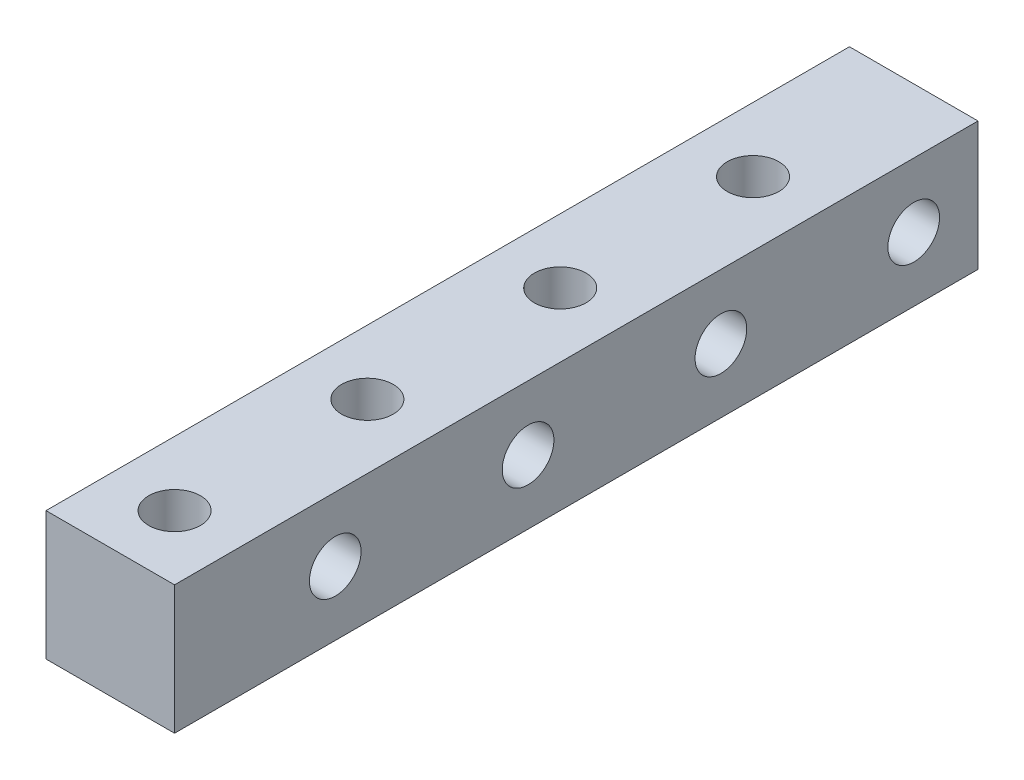
ISO-10303-21;
HEADER;
FILE_DESCRIPTION(('STEP AP214'),'2;1');
FILE_NAME('part.step','',(''),(''),'','','');
FILE_SCHEMA(('AUTOMOTIVE_DESIGN { 1 0 10303 214 1 1 1 1 }'));
ENDSEC;
DATA;
#1=APPLICATION_CONTEXT('core data for automotive mechanical design processes');
#2=APPLICATION_PROTOCOL_DEFINITION('international standard','automotive_design',2000,#1);
#3=PRODUCT_CONTEXT('',#1,'mechanical');
#4=PRODUCT('Part','Part','',(#3));
#5=PRODUCT_RELATED_PRODUCT_CATEGORY('part','',(#4));
#6=PRODUCT_DEFINITION_FORMATION('','',#4);
#7=PRODUCT_DEFINITION_CONTEXT('part definition',#1,'design');
#8=PRODUCT_DEFINITION('design','',#6,#7);
#9=PRODUCT_DEFINITION_SHAPE('','',#8);
#10=(LENGTH_UNIT() NAMED_UNIT(*) SI_UNIT(.MILLI.,.METRE.));
#11=(NAMED_UNIT(*) PLANE_ANGLE_UNIT() SI_UNIT($,.RADIAN.));
#12=(NAMED_UNIT(*) SI_UNIT($,.STERADIAN.) SOLID_ANGLE_UNIT());
#13=UNCERTAINTY_MEASURE_WITH_UNIT(LENGTH_MEASURE(1.E-05),#10,'distance_accuracy_value','');
#14=(GEOMETRIC_REPRESENTATION_CONTEXT(3) GLOBAL_UNCERTAINTY_ASSIGNED_CONTEXT((#13)) GLOBAL_UNIT_ASSIGNED_CONTEXT((#10,
#11,#12)) REPRESENTATION_CONTEXT('',''));
#15=CARTESIAN_POINT('',(0.,0.,0.));
#16=DIRECTION('',(0.,0.,1.));
#17=DIRECTION('',(1.,0.,0.));
#18=AXIS2_PLACEMENT_3D('',#15,#16,#17);
#19=CARTESIAN_POINT('',(6.35,0.,-73.025));
#20=DIRECTION('',(1.,0.,0.));
#21=DIRECTION('',(0.,0.,-1.));
#22=AXIS2_PLACEMENT_3D('',#19,#20,#21);
#23=CYLINDRICAL_SURFACE('',#22,2.55269999999999);
#24=CARTESIAN_POINT('',(6.35,0.,-73.025));
#25=DIRECTION('',(1.,0.,0.));
#26=DIRECTION('',(0.,0.,-1.));
#27=AXIS2_PLACEMENT_3D('',#24,#25,#26);
#28=CIRCLE('',#27,2.55269999999999);
#29=CARTESIAN_POINT('',(6.35,0.,-75.5777));
#30=VERTEX_POINT('',#29);
#31=EDGE_CURVE('E98',#30,#30,#28,.F.);
#32=ORIENTED_EDGE('',*,*,#31,.F.);
#33=EDGE_LOOP('',(#32));
#34=FACE_BOUND('',#33,.T.);
#35=CARTESIAN_POINT('',(-6.35,0.,-73.025));
#36=DIRECTION('',(1.,0.,0.));
#37=DIRECTION('',(0.,0.,-1.));
#38=AXIS2_PLACEMENT_3D('',#35,#36,#37);
#39=CIRCLE('',#38,2.55269999999999);
#40=CARTESIAN_POINT('',(-6.35,0.,-75.5777));
#41=VERTEX_POINT('',#40);
#42=EDGE_CURVE('E21',#41,#41,#39,.T.);
#43=ORIENTED_EDGE('',*,*,#42,.F.);
#44=EDGE_LOOP('',(#43));
#45=FACE_BOUND('',#44,.T.);
#46=ADVANCED_FACE('F18',(#34,#45),#23,.F.);
#47=CARTESIAN_POINT('',(6.35,0.,-53.975));
#48=DIRECTION('',(1.,0.,0.));
#49=DIRECTION('',(0.,0.,-1.));
#50=AXIS2_PLACEMENT_3D('',#47,#48,#49);
#51=CYLINDRICAL_SURFACE('',#50,2.5527);
#52=CARTESIAN_POINT('',(6.35,0.,-53.975));
#53=DIRECTION('',(1.,0.,0.));
#54=DIRECTION('',(0.,0.,-1.));
#55=AXIS2_PLACEMENT_3D('',#52,#53,#54);
#56=CIRCLE('',#55,2.5527);
#57=CARTESIAN_POINT('',(6.35,0.,-56.5277));
#58=VERTEX_POINT('',#57);
#59=EDGE_CURVE('E176',#58,#58,#56,.F.);
#60=ORIENTED_EDGE('',*,*,#59,.F.);
#61=EDGE_LOOP('',(#60));
#62=FACE_BOUND('',#61,.T.);
#63=CARTESIAN_POINT('',(-6.35,0.,-53.975));
#64=DIRECTION('',(1.,0.,0.));
#65=DIRECTION('',(0.,0.,-1.));
#66=AXIS2_PLACEMENT_3D('',#63,#64,#65);
#67=CIRCLE('',#66,2.5527);
#68=CARTESIAN_POINT('',(-6.35,0.,-56.5277));
#69=VERTEX_POINT('',#68);
#70=EDGE_CURVE('E102',#69,#69,#67,.T.);
#71=ORIENTED_EDGE('',*,*,#70,.F.);
#72=EDGE_LOOP('',(#71));
#73=FACE_BOUND('',#72,.T.);
#74=ADVANCED_FACE('F112',(#62,#73),#51,.F.);
#75=CARTESIAN_POINT('',(6.35,0.,-34.925));
#76=DIRECTION('',(1.,0.,0.));
#77=DIRECTION('',(0.,0.,-1.));
#78=AXIS2_PLACEMENT_3D('',#75,#76,#77);
#79=CYLINDRICAL_SURFACE('',#78,2.5527);
#80=CARTESIAN_POINT('',(6.35,0.,-34.925));
#81=DIRECTION('',(1.,0.,0.));
#82=DIRECTION('',(0.,0.,-1.));
#83=AXIS2_PLACEMENT_3D('',#80,#81,#82);
#84=CIRCLE('',#83,2.5527);
#85=CARTESIAN_POINT('',(6.35,0.,-37.4777));
#86=VERTEX_POINT('',#85);
#87=EDGE_CURVE('E171',#86,#86,#84,.F.);
#88=ORIENTED_EDGE('',*,*,#87,.F.);
#89=EDGE_LOOP('',(#88));
#90=FACE_BOUND('',#89,.T.);
#91=CARTESIAN_POINT('',(-6.35,0.,-34.925));
#92=DIRECTION('',(1.,0.,0.));
#93=DIRECTION('',(0.,0.,-1.));
#94=AXIS2_PLACEMENT_3D('',#91,#92,#93);
#95=CIRCLE('',#94,2.5527);
#96=CARTESIAN_POINT('',(-6.35,0.,-37.4777));
#97=VERTEX_POINT('',#96);
#98=EDGE_CURVE('E97',#97,#97,#95,.T.);
#99=ORIENTED_EDGE('',*,*,#98,.F.);
#100=EDGE_LOOP('',(#99));
#101=FACE_BOUND('',#100,.T.);
#102=ADVANCED_FACE('F118',(#90,#101),#79,.F.);
#103=CARTESIAN_POINT('',(6.35,0.,-15.875));
#104=DIRECTION('',(1.,0.,0.));
#105=DIRECTION('',(0.,0.,-1.));
#106=AXIS2_PLACEMENT_3D('',#103,#104,#105);
#107=CYLINDRICAL_SURFACE('',#106,2.5527);
#108=CARTESIAN_POINT('',(6.35,0.,-15.875));
#109=DIRECTION('',(1.,0.,0.));
#110=DIRECTION('',(0.,0.,-1.));
#111=AXIS2_PLACEMENT_3D('',#108,#109,#110);
#112=CIRCLE('',#111,2.5527);
#113=CARTESIAN_POINT('',(6.35,0.,-18.4277));
#114=VERTEX_POINT('',#113);
#115=EDGE_CURVE('E175',#114,#114,#112,.F.);
#116=ORIENTED_EDGE('',*,*,#115,.F.);
#117=EDGE_LOOP('',(#116));
#118=FACE_BOUND('',#117,.T.);
#119=CARTESIAN_POINT('',(-6.35,0.,-15.875));
#120=DIRECTION('',(1.,0.,0.));
#121=DIRECTION('',(0.,0.,-1.));
#122=AXIS2_PLACEMENT_3D('',#119,#120,#121);
#123=CIRCLE('',#122,2.5527);
#124=CARTESIAN_POINT('',(-6.35,0.,-18.4277));
#125=VERTEX_POINT('',#124);
#126=EDGE_CURVE('E92',#125,#125,#123,.T.);
#127=ORIENTED_EDGE('',*,*,#126,.F.);
#128=EDGE_LOOP('',(#127));
#129=FACE_BOUND('',#128,.T.);
#130=ADVANCED_FACE('F159',(#118,#129),#107,.F.);
#131=CARTESIAN_POINT('',(6.35,-6.35,-85.725));
#132=DIRECTION('',(0.,-1.,0.));
#133=DIRECTION('',(1.,0.,0.));
#134=AXIS2_PLACEMENT_3D('',#131,#132,#133);
#135=PLANE('',#134);
#136=CARTESIAN_POINT('',(0.,-6.35,-63.5));
#137=DIRECTION('',(0.,1.,0.));
#138=DIRECTION('',(0.,0.,1.));
#139=AXIS2_PLACEMENT_3D('',#136,#137,#138);
#140=CIRCLE('',#139,2.5527);
#141=CARTESIAN_POINT('',(0.,-6.35,-60.9473));
#142=VERTEX_POINT('',#141);
#143=EDGE_CURVE('E179',#142,#142,#140,.T.);
#144=ORIENTED_EDGE('',*,*,#143,.T.);
#145=EDGE_LOOP('',(#144));
#146=FACE_BOUND('',#145,.T.);
#147=CARTESIAN_POINT('',(0.,-6.35,-44.45));
#148=DIRECTION('',(0.,1.,0.));
#149=DIRECTION('',(0.,0.,1.));
#150=AXIS2_PLACEMENT_3D('',#147,#148,#149);
#151=CIRCLE('',#150,2.5527);
#152=CARTESIAN_POINT('',(0.,-6.35,-41.8973));
#153=VERTEX_POINT('',#152);
#154=EDGE_CURVE('E186',#153,#153,#151,.T.);
#155=ORIENTED_EDGE('',*,*,#154,.T.);
#156=EDGE_LOOP('',(#155));
#157=FACE_BOUND('',#156,.T.);
#158=CARTESIAN_POINT('',(0.,-6.35,-25.4));
#159=DIRECTION('',(0.,1.,0.));
#160=DIRECTION('',(0.,0.,1.));
#161=AXIS2_PLACEMENT_3D('',#158,#159,#160);
#162=CIRCLE('',#161,2.5527);
#163=CARTESIAN_POINT('',(0.,-6.35,-22.8473));
#164=VERTEX_POINT('',#163);
#165=EDGE_CURVE('E193',#164,#164,#162,.T.);
#166=ORIENTED_EDGE('',*,*,#165,.T.);
#167=EDGE_LOOP('',(#166));
#168=FACE_BOUND('',#167,.T.);
#169=CARTESIAN_POINT('',(0.,-6.35,-6.35));
#170=DIRECTION('',(0.,1.,0.));
#171=DIRECTION('',(0.,0.,1.));
#172=AXIS2_PLACEMENT_3D('',#169,#170,#171);
#173=CIRCLE('',#172,2.5527);
#174=CARTESIAN_POINT('',(0.,-6.35,-3.7973));
#175=VERTEX_POINT('',#174);
#176=EDGE_CURVE('E196',#175,#175,#173,.T.);
#177=ORIENTED_EDGE('',*,*,#176,.T.);
#178=EDGE_LOOP('',(#177));
#179=FACE_BOUND('',#178,.T.);
#180=DIRECTION('',(1.,0.,0.));
#181=VECTOR('',#180,1.);
#182=CARTESIAN_POINT('',(-6.35,-6.35,0.));
#183=LINE('',#182,#181);
#184=CARTESIAN_POINT('',(-6.35,-6.35,0.));
#185=VERTEX_POINT('',#184);
#186=CARTESIAN_POINT('',(6.35,-6.35,0.));
#187=VERTEX_POINT('',#186);
#188=EDGE_CURVE('E73',#185,#187,#183,.T.);
#189=ORIENTED_EDGE('',*,*,#188,.F.);
#190=DIRECTION('',(0.,0.,1.));
#191=VECTOR('',#190,1.);
#192=CARTESIAN_POINT('',(-6.35,-6.35,-85.725));
#193=LINE('',#192,#191);
#194=CARTESIAN_POINT('',(-6.35,-6.35,-79.375));
#195=VERTEX_POINT('',#194);
#196=EDGE_CURVE('E57',#195,#185,#193,.T.);
#197=ORIENTED_EDGE('',*,*,#196,.F.);
#198=DIRECTION('',(1.,0.,0.));
#199=VECTOR('',#198,1.);
#200=CARTESIAN_POINT('',(-6.35000000000001,-6.35,-79.375));
#201=LINE('',#200,#199);
#202=CARTESIAN_POINT('',(6.35,-6.35,-79.375));
#203=VERTEX_POINT('',#202);
#204=EDGE_CURVE('E62',#195,#203,#201,.T.);
#205=ORIENTED_EDGE('',*,*,#204,.T.);
#206=DIRECTION('',(0.,0.,-1.));
#207=VECTOR('',#206,1.);
#208=CARTESIAN_POINT('',(6.35,-6.35,-85.725));
#209=LINE('',#208,#207);
#210=EDGE_CURVE('E228',#187,#203,#209,.T.);
#211=ORIENTED_EDGE('',*,*,#210,.F.);
#212=EDGE_LOOP('',(#189,#197,#205,#211));
#213=FACE_BOUND('',#212,.T.);
#214=ADVANCED_FACE('F72',(#146,#157,#168,#179,#213),#135,.T.);
#215=CARTESIAN_POINT('',(-6.35000000000001,6.35,-79.375));
#216=DIRECTION('',(0.,0.,1.));
#217=DIRECTION('',(1.,0.,0.));
#218=AXIS2_PLACEMENT_3D('',#215,#216,#217);
#219=PLANE('',#218);
#220=ORIENTED_EDGE('',*,*,#204,.F.);
#221=DIRECTION('',(0.,1.,0.));
#222=VECTOR('',#221,1.);
#223=CARTESIAN_POINT('',(-6.35,-6.35,-79.375));
#224=LINE('',#223,#222);
#225=CARTESIAN_POINT('',(-6.35,6.35,-79.375));
#226=VERTEX_POINT('',#225);
#227=EDGE_CURVE('E64',#226,#195,#224,.F.);
#228=ORIENTED_EDGE('',*,*,#227,.F.);
#229=DIRECTION('',(-1.,0.,0.));
#230=VECTOR('',#229,1.);
#231=CARTESIAN_POINT('',(6.35,6.35,-79.375));
#232=LINE('',#231,#230);
#233=CARTESIAN_POINT('',(6.35,6.35,-79.375));
#234=VERTEX_POINT('',#233);
#235=EDGE_CURVE('E200',#234,#226,#232,.T.);
#236=ORIENTED_EDGE('',*,*,#235,.F.);
#237=DIRECTION('',(0.,1.,0.));
#238=VECTOR('',#237,1.);
#239=CARTESIAN_POINT('',(6.35,-6.35,-79.375));
#240=LINE('',#239,#238);
#241=EDGE_CURVE('E67',#203,#234,#240,.T.);
#242=ORIENTED_EDGE('',*,*,#241,.F.);
#243=EDGE_LOOP('',(#220,#228,#236,#242));
#244=FACE_BOUND('',#243,.T.);
#245=ADVANCED_FACE('F63',(#244),#219,.F.);
#246=CARTESIAN_POINT('',(-6.35,-6.35,-85.725));
#247=DIRECTION('',(-1.,0.,0.));
#248=DIRECTION('',(0.,0.,1.));
#249=AXIS2_PLACEMENT_3D('',#246,#247,#248);
#250=PLANE('',#249);
#251=ORIENTED_EDGE('',*,*,#126,.T.);
#252=EDGE_LOOP('',(#251));
#253=FACE_BOUND('',#252,.T.);
#254=ORIENTED_EDGE('',*,*,#98,.T.);
#255=EDGE_LOOP('',(#254));
#256=FACE_BOUND('',#255,.T.);
#257=ORIENTED_EDGE('',*,*,#70,.T.);
#258=EDGE_LOOP('',(#257));
#259=FACE_BOUND('',#258,.T.);
#260=ORIENTED_EDGE('',*,*,#42,.T.);
#261=EDGE_LOOP('',(#260));
#262=FACE_BOUND('',#261,.T.);
#263=DIRECTION('',(0.,1.,0.));
#264=VECTOR('',#263,1.);
#265=CARTESIAN_POINT('',(-6.35,6.35,0.));
#266=LINE('',#265,#264);
#267=CARTESIAN_POINT('',(-6.35,6.35,0.));
#268=VERTEX_POINT('',#267);
#269=EDGE_CURVE('E96',#268,#185,#266,.F.);
#270=ORIENTED_EDGE('',*,*,#269,.F.);
#271=DIRECTION('',(0.,0.,1.));
#272=VECTOR('',#271,1.);
#273=CARTESIAN_POINT('',(-6.35,6.35,-85.725));
#274=LINE('',#273,#272);
#275=EDGE_CURVE('E78',#226,#268,#274,.T.);
#276=ORIENTED_EDGE('',*,*,#275,.F.);
#277=ORIENTED_EDGE('',*,*,#227,.T.);
#278=ORIENTED_EDGE('',*,*,#196,.T.);
#279=EDGE_LOOP('',(#270,#276,#277,#278));
#280=FACE_BOUND('',#279,.T.);
#281=ADVANCED_FACE('F76',(#253,#256,#259,#262,#280),#250,.T.);
#282=CARTESIAN_POINT('',(-6.35,6.35,0.));
#283=DIRECTION('',(0.,0.,1.));
#284=DIRECTION('',(1.,0.,0.));
#285=AXIS2_PLACEMENT_3D('',#282,#283,#284);
#286=PLANE('',#285);
#287=DIRECTION('',(0.,1.,0.));
#288=VECTOR('',#287,1.);
#289=CARTESIAN_POINT('',(6.35,-6.35,0.));
#290=LINE('',#289,#288);
#291=CARTESIAN_POINT('',(6.35,6.35,0.));
#292=VERTEX_POINT('',#291);
#293=EDGE_CURVE('E37',#292,#187,#290,.F.);
#294=ORIENTED_EDGE('',*,*,#293,.F.);
#295=DIRECTION('',(-1.,0.,0.));
#296=VECTOR('',#295,1.);
#297=CARTESIAN_POINT('',(6.35,6.35,0.));
#298=LINE('',#297,#296);
#299=EDGE_CURVE('E222',#268,#292,#298,.F.);
#300=ORIENTED_EDGE('',*,*,#299,.F.);
#301=ORIENTED_EDGE('',*,*,#269,.T.);
#302=ORIENTED_EDGE('',*,*,#188,.T.);
#303=EDGE_LOOP('',(#294,#300,#301,#302));
#304=FACE_BOUND('',#303,.T.);
#305=ADVANCED_FACE('F148',(#304),#286,.T.);
#306=CARTESIAN_POINT('',(6.35,-6.35,-85.725));
#307=DIRECTION('',(1.,0.,0.));
#308=DIRECTION('',(0.,0.,-1.));
#309=AXIS2_PLACEMENT_3D('',#306,#307,#308);
#310=PLANE('',#309);
#311=ORIENTED_EDGE('',*,*,#115,.T.);
#312=EDGE_LOOP('',(#311));
#313=FACE_BOUND('',#312,.T.);
#314=ORIENTED_EDGE('',*,*,#87,.T.);
#315=EDGE_LOOP('',(#314));
#316=FACE_BOUND('',#315,.T.);
#317=ORIENTED_EDGE('',*,*,#59,.T.);
#318=EDGE_LOOP('',(#317));
#319=FACE_BOUND('',#318,.T.);
#320=ORIENTED_EDGE('',*,*,#31,.T.);
#321=EDGE_LOOP('',(#320));
#322=FACE_BOUND('',#321,.T.);
#323=ORIENTED_EDGE('',*,*,#293,.T.);
#324=ORIENTED_EDGE('',*,*,#210,.T.);
#325=ORIENTED_EDGE('',*,*,#241,.T.);
#326=DIRECTION('',(0.,0.,1.));
#327=VECTOR('',#326,1.);
#328=CARTESIAN_POINT('',(6.35,6.35,-85.725));
#329=LINE('',#328,#327);
#330=EDGE_CURVE('E205',#292,#234,#329,.F.);
#331=ORIENTED_EDGE('',*,*,#330,.F.);
#332=EDGE_LOOP('',(#323,#324,#325,#331));
#333=FACE_BOUND('',#332,.T.);
#334=ADVANCED_FACE('F144',(#313,#316,#319,#322,#333),#310,.T.);
#335=CARTESIAN_POINT('',(0.,6.35,-63.5));
#336=DIRECTION('',(0.,1.,0.));
#337=DIRECTION('',(0.,0.,1.));
#338=AXIS2_PLACEMENT_3D('',#335,#336,#337);
#339=CYLINDRICAL_SURFACE('',#338,2.5527);
#340=CARTESIAN_POINT('',(0.,6.35,-63.5));
#341=DIRECTION('',(0.,1.,0.));
#342=DIRECTION('',(0.,0.,1.));
#343=AXIS2_PLACEMENT_3D('',#340,#341,#342);
#344=CIRCLE('',#343,2.5527);
#345=CARTESIAN_POINT('',(0.,6.35,-60.9473));
#346=VERTEX_POINT('',#345);
#347=EDGE_CURVE('E201',#346,#346,#344,.F.);
#348=ORIENTED_EDGE('',*,*,#347,.F.);
#349=EDGE_LOOP('',(#348));
#350=FACE_BOUND('',#349,.T.);
#351=ORIENTED_EDGE('',*,*,#143,.F.);
#352=EDGE_LOOP('',(#351));
#353=FACE_BOUND('',#352,.T.);
#354=ADVANCED_FACE('F140',(#350,#353),#339,.F.);
#355=CARTESIAN_POINT('',(0.,6.35,-44.45));
#356=DIRECTION('',(0.,1.,0.));
#357=DIRECTION('',(0.,0.,1.));
#358=AXIS2_PLACEMENT_3D('',#355,#356,#357);
#359=CYLINDRICAL_SURFACE('',#358,2.5527);
#360=CARTESIAN_POINT('',(0.,6.35,-44.45));
#361=DIRECTION('',(0.,1.,0.));
#362=DIRECTION('',(0.,0.,1.));
#363=AXIS2_PLACEMENT_3D('',#360,#361,#362);
#364=CIRCLE('',#363,2.5527);
#365=CARTESIAN_POINT('',(0.,6.35,-41.8973));
#366=VERTEX_POINT('',#365);
#367=EDGE_CURVE('E204',#366,#366,#364,.F.);
#368=ORIENTED_EDGE('',*,*,#367,.F.);
#369=EDGE_LOOP('',(#368));
#370=FACE_BOUND('',#369,.T.);
#371=ORIENTED_EDGE('',*,*,#154,.F.);
#372=EDGE_LOOP('',(#371));
#373=FACE_BOUND('',#372,.T.);
#374=ADVANCED_FACE('F136',(#370,#373),#359,.F.);
#375=CARTESIAN_POINT('',(0.,6.35,-25.4));
#376=DIRECTION('',(0.,1.,0.));
#377=DIRECTION('',(0.,0.,1.));
#378=AXIS2_PLACEMENT_3D('',#375,#376,#377);
#379=CYLINDRICAL_SURFACE('',#378,2.5527);
#380=CARTESIAN_POINT('',(0.,6.35,-25.4));
#381=DIRECTION('',(0.,1.,0.));
#382=DIRECTION('',(0.,0.,1.));
#383=AXIS2_PLACEMENT_3D('',#380,#381,#382);
#384=CIRCLE('',#383,2.5527);
#385=CARTESIAN_POINT('',(0.,6.35,-22.8473));
#386=VERTEX_POINT('',#385);
#387=EDGE_CURVE('E28',#386,#386,#384,.F.);
#388=ORIENTED_EDGE('',*,*,#387,.F.);
#389=EDGE_LOOP('',(#388));
#390=FACE_BOUND('',#389,.T.);
#391=ORIENTED_EDGE('',*,*,#165,.F.);
#392=EDGE_LOOP('',(#391));
#393=FACE_BOUND('',#392,.T.);
#394=ADVANCED_FACE('F129',(#390,#393),#379,.F.);
#395=CARTESIAN_POINT('',(0.,6.35,-6.35));
#396=DIRECTION('',(0.,1.,0.));
#397=DIRECTION('',(0.,0.,1.));
#398=AXIS2_PLACEMENT_3D('',#395,#396,#397);
#399=CYLINDRICAL_SURFACE('',#398,2.5527);
#400=CARTESIAN_POINT('',(0.,6.35,-6.35));
#401=DIRECTION('',(0.,1.,0.));
#402=DIRECTION('',(0.,0.,1.));
#403=AXIS2_PLACEMENT_3D('',#400,#401,#402);
#404=CIRCLE('',#403,2.5527);
#405=CARTESIAN_POINT('',(0.,6.35,-3.7973));
#406=VERTEX_POINT('',#405);
#407=EDGE_CURVE('E12',#406,#406,#404,.F.);
#408=ORIENTED_EDGE('',*,*,#407,.F.);
#409=EDGE_LOOP('',(#408));
#410=FACE_BOUND('',#409,.T.);
#411=ORIENTED_EDGE('',*,*,#176,.F.);
#412=EDGE_LOOP('',(#411));
#413=FACE_BOUND('',#412,.T.);
#414=ADVANCED_FACE('F123',(#410,#413),#399,.F.);
#415=CARTESIAN_POINT('',(6.35,6.35,-85.725));
#416=DIRECTION('',(0.,1.,0.));
#417=DIRECTION('',(-1.,0.,0.));
#418=AXIS2_PLACEMENT_3D('',#415,#416,#417);
#419=PLANE('',#418);
#420=ORIENTED_EDGE('',*,*,#407,.T.);
#421=EDGE_LOOP('',(#420));
#422=FACE_BOUND('',#421,.T.);
#423=ORIENTED_EDGE('',*,*,#387,.T.);
#424=EDGE_LOOP('',(#423));
#425=FACE_BOUND('',#424,.T.);
#426=ORIENTED_EDGE('',*,*,#367,.T.);
#427=EDGE_LOOP('',(#426));
#428=FACE_BOUND('',#427,.T.);
#429=ORIENTED_EDGE('',*,*,#347,.T.);
#430=EDGE_LOOP('',(#429));
#431=FACE_BOUND('',#430,.T.);
#432=ORIENTED_EDGE('',*,*,#299,.T.);
#433=ORIENTED_EDGE('',*,*,#330,.T.);
#434=ORIENTED_EDGE('',*,*,#235,.T.);
#435=ORIENTED_EDGE('',*,*,#275,.T.);
#436=EDGE_LOOP('',(#432,#433,#434,#435));
#437=FACE_BOUND('',#436,.T.);
#438=ADVANCED_FACE('F121',(#422,#425,#428,#431,#437),#419,.T.);
#439=CLOSED_SHELL('',(#46,#74,#102,#130,#214,#245,#281,#305,#334,#354,#374,#394,#414,#438));
#440=MANIFOLD_SOLID_BREP('B1',#439);
#441=ADVANCED_BREP_SHAPE_REPRESENTATION('',(#18,#440),#14);
#442=SHAPE_DEFINITION_REPRESENTATION(#9,#441);
ENDSEC;
END-ISO-10303-21;
